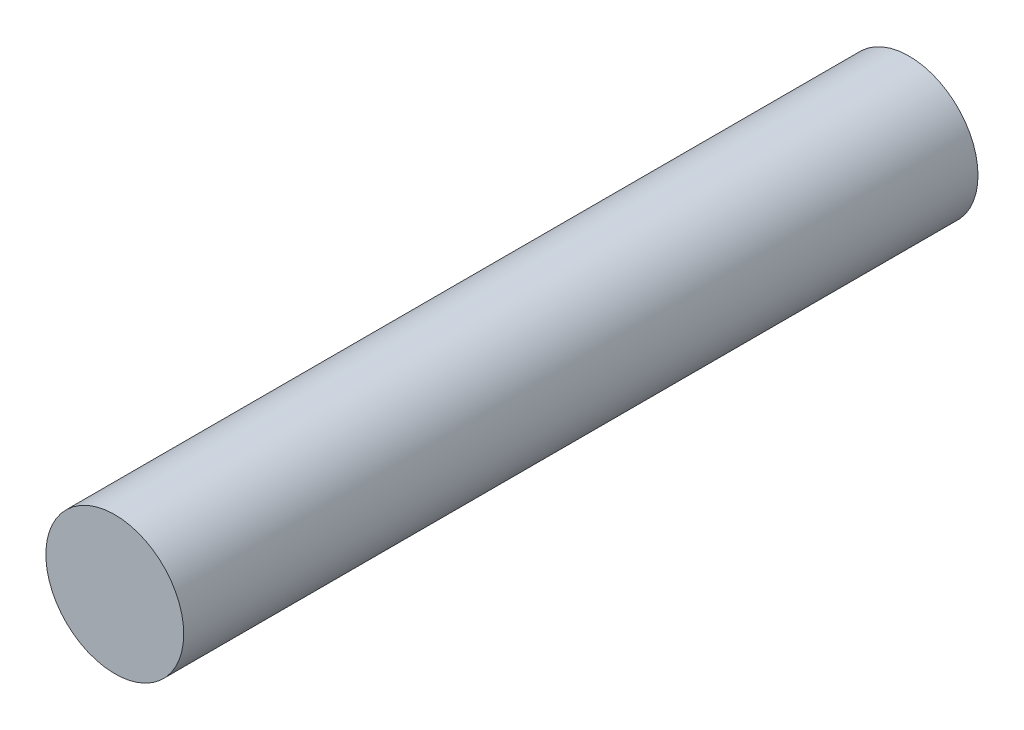
ISO-10303-21;
HEADER;
FILE_DESCRIPTION(('STEP AP214'),'2;1');
FILE_NAME('part.step','',(''),(''),'','','');
FILE_SCHEMA(('AUTOMOTIVE_DESIGN { 1 0 10303 214 1 1 1 1 }'));
ENDSEC;
DATA;
#1=APPLICATION_CONTEXT('core data for automotive mechanical design processes');
#2=APPLICATION_PROTOCOL_DEFINITION('international standard','automotive_design',2000,#1);
#3=PRODUCT_CONTEXT('',#1,'mechanical');
#4=PRODUCT('Part','Part','',(#3));
#5=PRODUCT_RELATED_PRODUCT_CATEGORY('part','',(#4));
#6=PRODUCT_DEFINITION_FORMATION('','',#4);
#7=PRODUCT_DEFINITION_CONTEXT('part definition',#1,'design');
#8=PRODUCT_DEFINITION('design','',#6,#7);
#9=PRODUCT_DEFINITION_SHAPE('','',#8);
#10=(LENGTH_UNIT() NAMED_UNIT(*) SI_UNIT(.MILLI.,.METRE.));
#11=(NAMED_UNIT(*) PLANE_ANGLE_UNIT() SI_UNIT($,.RADIAN.));
#12=(NAMED_UNIT(*) SI_UNIT($,.STERADIAN.) SOLID_ANGLE_UNIT());
#13=UNCERTAINTY_MEASURE_WITH_UNIT(LENGTH_MEASURE(1.E-05),#10,'distance_accuracy_value','');
#14=(GEOMETRIC_REPRESENTATION_CONTEXT(3) GLOBAL_UNCERTAINTY_ASSIGNED_CONTEXT((#13)) GLOBAL_UNIT_ASSIGNED_CONTEXT((#10,
#11,#12)) REPRESENTATION_CONTEXT('',''));
#15=CARTESIAN_POINT('',(0.,0.,0.));
#16=DIRECTION('',(0.,0.,1.));
#17=DIRECTION('',(1.,0.,0.));
#18=AXIS2_PLACEMENT_3D('',#15,#16,#17);
#19=CARTESIAN_POINT('',(0.,0.,46.1));
#20=DIRECTION('',(0.,0.,-1.));
#21=DIRECTION('',(-1.,0.,0.));
#22=AXIS2_PLACEMENT_3D('',#19,#20,#21);
#23=CYLINDRICAL_SURFACE('',#22,4.);
#24=CARTESIAN_POINT('',(0.,0.,46.1));
#25=DIRECTION('',(0.,0.,1.));
#26=DIRECTION('',(1.,0.,0.));
#27=AXIS2_PLACEMENT_3D('',#24,#25,#26);
#28=CIRCLE('',#27,4.);
#29=CARTESIAN_POINT('',(4.,0.,46.1));
#30=VERTEX_POINT('',#29);
#31=EDGE_CURVE('E10',#30,#30,#28,.T.);
#32=ORIENTED_EDGE('',*,*,#31,.F.);
#33=EDGE_LOOP('',(#32));
#34=FACE_BOUND('',#33,.T.);
#35=CARTESIAN_POINT('',(0.,0.,0.));
#36=DIRECTION('',(0.,0.,1.));
#37=DIRECTION('',(1.,0.,0.));
#38=AXIS2_PLACEMENT_3D('',#35,#36,#37);
#39=CIRCLE('',#38,4.);
#40=CARTESIAN_POINT('',(4.,0.,0.));
#41=VERTEX_POINT('',#40);
#42=EDGE_CURVE('E35',#41,#41,#39,.T.);
#43=ORIENTED_EDGE('',*,*,#42,.T.);
#44=EDGE_LOOP('',(#43));
#45=FACE_BOUND('',#44,.T.);
#46=ADVANCED_FACE('F32',(#34,#45),#23,.T.);
#47=CARTESIAN_POINT('',(0.,0.,46.1));
#48=DIRECTION('',(0.,0.,1.));
#49=DIRECTION('',(1.,0.,0.));
#50=AXIS2_PLACEMENT_3D('',#47,#48,#49);
#51=PLANE('',#50);
#52=ORIENTED_EDGE('',*,*,#31,.T.);
#53=EDGE_LOOP('',(#52));
#54=FACE_BOUND('',#53,.T.);
#55=ADVANCED_FACE('F47',(#54),#51,.T.);
#56=CARTESIAN_POINT('',(0.,0.,0.));
#57=DIRECTION('',(0.,0.,1.));
#58=DIRECTION('',(1.,0.,0.));
#59=AXIS2_PLACEMENT_3D('',#56,#57,#58);
#60=PLANE('',#59);
#61=ORIENTED_EDGE('',*,*,#42,.F.);
#62=EDGE_LOOP('',(#61));
#63=FACE_BOUND('',#62,.T.);
#64=ADVANCED_FACE('F45',(#63),#60,.F.);
#65=CLOSED_SHELL('',(#46,#55,#64));
#66=MANIFOLD_SOLID_BREP('B2',#65);
#67=ADVANCED_BREP_SHAPE_REPRESENTATION('',(#18,#66),#14);
#68=SHAPE_DEFINITION_REPRESENTATION(#9,#67);
ENDSEC;
END-ISO-10303-21;
